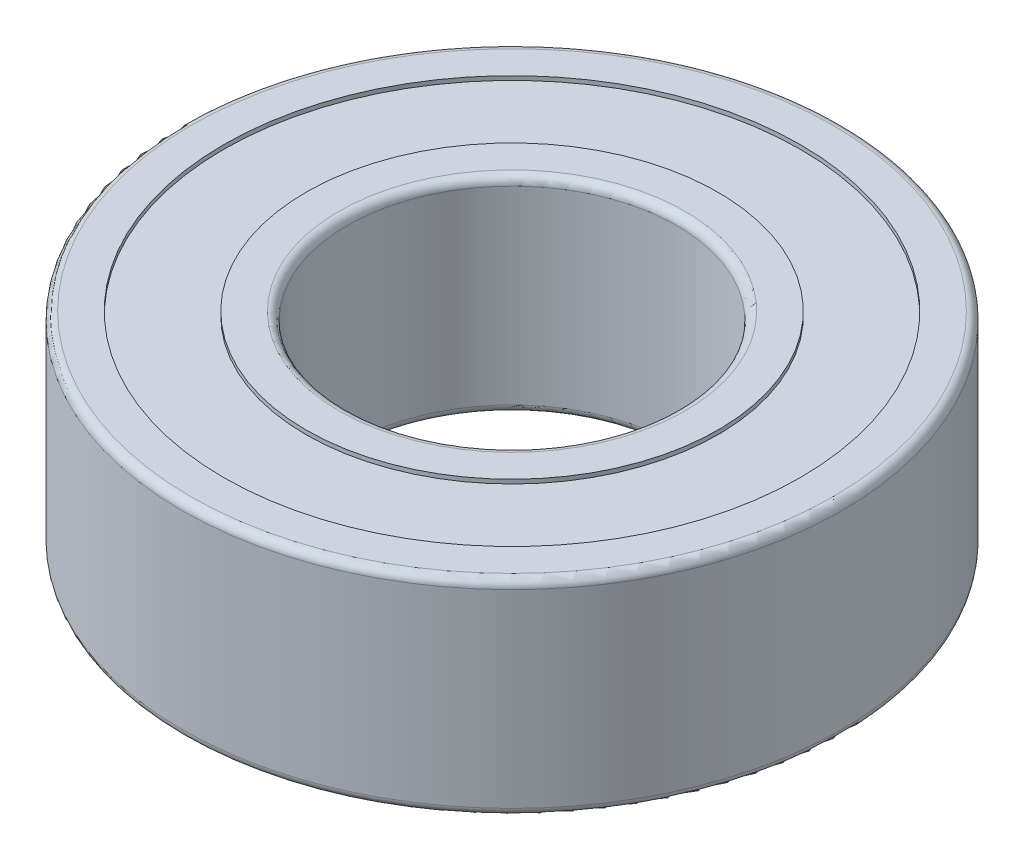
ISO-10303-21;
HEADER;
FILE_DESCRIPTION(('STEP AP214'),'2;1');
FILE_NAME('part.step','',(''),(''),'','','');
FILE_SCHEMA(('AUTOMOTIVE_DESIGN { 1 0 10303 214 1 1 1 1 }'));
ENDSEC;
DATA;
#1=APPLICATION_CONTEXT('core data for automotive mechanical design processes');
#2=APPLICATION_PROTOCOL_DEFINITION('international standard','automotive_design',2000,#1);
#3=PRODUCT_CONTEXT('',#1,'mechanical');
#4=PRODUCT('Part','Part','',(#3));
#5=PRODUCT_RELATED_PRODUCT_CATEGORY('part','',(#4));
#6=PRODUCT_DEFINITION_FORMATION('','',#4);
#7=PRODUCT_DEFINITION_CONTEXT('part definition',#1,'design');
#8=PRODUCT_DEFINITION('design','',#6,#7);
#9=PRODUCT_DEFINITION_SHAPE('','',#8);
#10=(LENGTH_UNIT() NAMED_UNIT(*) SI_UNIT(.MILLI.,.METRE.));
#11=(NAMED_UNIT(*) PLANE_ANGLE_UNIT() SI_UNIT($,.RADIAN.));
#12=(NAMED_UNIT(*) SI_UNIT($,.STERADIAN.) SOLID_ANGLE_UNIT());
#13=UNCERTAINTY_MEASURE_WITH_UNIT(LENGTH_MEASURE(1.E-05),#10,'distance_accuracy_value','');
#14=(GEOMETRIC_REPRESENTATION_CONTEXT(3) GLOBAL_UNCERTAINTY_ASSIGNED_CONTEXT((#13)) GLOBAL_UNIT_ASSIGNED_CONTEXT((#10,
#11,#12)) REPRESENTATION_CONTEXT('',''));
#15=CARTESIAN_POINT('',(0.,0.,0.));
#16=DIRECTION('',(0.,0.,1.));
#17=DIRECTION('',(1.,0.,0.));
#18=AXIS2_PLACEMENT_3D('',#15,#16,#17);
#19=CARTESIAN_POINT('',(0.,0.,0.));
#20=DIRECTION('',(0.,1.,0.));
#21=DIRECTION('',(0.,0.,1.));
#22=AXIS2_PLACEMENT_3D('',#19,#20,#21);
#23=PLANE('',#22);
#24=CARTESIAN_POINT('',(0.,0.,0.));
#25=DIRECTION('',(0.,1.,0.));
#26=DIRECTION('',(0.,0.,1.));
#27=AXIS2_PLACEMENT_3D('',#24,#25,#26);
#28=CIRCLE('',#27,4.2);
#29=CARTESIAN_POINT('',(0.,0.,4.2));
#30=VERTEX_POINT('',#29);
#31=EDGE_CURVE('E69',#30,#30,#28,.T.);
#32=ORIENTED_EDGE('',*,*,#31,.T.);
#33=EDGE_LOOP('',(#32));
#34=FACE_BOUND('',#33,.T.);
#35=CARTESIAN_POINT('',(0.,0.,0.));
#36=DIRECTION('',(0.,-1.,0.));
#37=DIRECTION('',(0.,0.,-1.));
#38=AXIS2_PLACEMENT_3D('',#35,#36,#37);
#39=CIRCLE('',#38,5.);
#40=CARTESIAN_POINT('',(0.,0.,-5.));
#41=VERTEX_POINT('',#40);
#42=EDGE_CURVE('E102',#41,#41,#39,.T.);
#43=ORIENTED_EDGE('',*,*,#42,.T.);
#44=EDGE_LOOP('',(#43));
#45=FACE_BOUND('',#44,.T.);
#46=ADVANCED_FACE('F37',(#34,#45),#23,.F.);
#47=CARTESIAN_POINT('',(0.,5.,0.));
#48=DIRECTION('',(0.,1.,0.));
#49=DIRECTION('',(0.,0.,1.));
#50=AXIS2_PLACEMENT_3D('',#47,#48,#49);
#51=PLANE('',#50);
#52=CARTESIAN_POINT('',(0.,5.,0.));
#53=DIRECTION('',(0.,1.,0.));
#54=DIRECTION('',(0.,0.,1.));
#55=AXIS2_PLACEMENT_3D('',#52,#53,#54);
#56=CIRCLE('',#55,4.2);
#57=CARTESIAN_POINT('',(0.,5.,4.2));
#58=VERTEX_POINT('',#57);
#59=EDGE_CURVE('E10',#58,#58,#56,.F.);
#60=ORIENTED_EDGE('',*,*,#59,.T.);
#61=EDGE_LOOP('',(#60));
#62=FACE_BOUND('',#61,.T.);
#63=CARTESIAN_POINT('',(0.,5.,0.));
#64=DIRECTION('',(0.,1.,0.));
#65=DIRECTION('',(0.,0.,1.));
#66=AXIS2_PLACEMENT_3D('',#63,#64,#65);
#67=CIRCLE('',#66,5.);
#68=CARTESIAN_POINT('',(0.,5.,5.));
#69=VERTEX_POINT('',#68);
#70=EDGE_CURVE('E86',#69,#69,#67,.T.);
#71=ORIENTED_EDGE('',*,*,#70,.T.);
#72=EDGE_LOOP('',(#71));
#73=FACE_BOUND('',#72,.T.);
#74=ADVANCED_FACE('F160',(#62,#73),#51,.T.);
#75=CARTESIAN_POINT('',(0.,5.,0.));
#76=DIRECTION('',(0.,1.,0.));
#77=DIRECTION('',(0.,0.,1.));
#78=AXIS2_PLACEMENT_3D('',#75,#76,#77);
#79=CIRCLE('',#78,7.);
#80=CARTESIAN_POINT('',(0.,5.,7.));
#81=VERTEX_POINT('',#80);
#82=EDGE_CURVE('E78',#81,#81,#79,.T.);
#83=ORIENTED_EDGE('',*,*,#82,.F.);
#84=EDGE_LOOP('',(#83));
#85=FACE_BOUND('',#84,.T.);
#86=CARTESIAN_POINT('',(0.,5.,0.));
#87=DIRECTION('',(0.,1.,0.));
#88=DIRECTION('',(0.,0.,1.));
#89=AXIS2_PLACEMENT_3D('',#86,#87,#88);
#90=CIRCLE('',#89,7.8);
#91=CARTESIAN_POINT('',(0.,5.,7.8));
#92=VERTEX_POINT('',#91);
#93=EDGE_CURVE('E45',#92,#92,#90,.T.);
#94=ORIENTED_EDGE('',*,*,#93,.T.);
#95=EDGE_LOOP('',(#94));
#96=FACE_BOUND('',#95,.T.);
#97=ADVANCED_FACE('F130',(#85,#96),#51,.T.);
#98=CARTESIAN_POINT('',(0.,0.,0.));
#99=DIRECTION('',(0.,-1.,0.));
#100=DIRECTION('',(0.,0.,-1.));
#101=AXIS2_PLACEMENT_3D('',#98,#99,#100);
#102=CIRCLE('',#101,7.);
#103=CARTESIAN_POINT('',(0.,0.,-7.));
#104=VERTEX_POINT('',#103);
#105=EDGE_CURVE('E94',#104,#104,#102,.T.);
#106=ORIENTED_EDGE('',*,*,#105,.F.);
#107=EDGE_LOOP('',(#106));
#108=FACE_BOUND('',#107,.T.);
#109=CARTESIAN_POINT('',(0.,0.,0.));
#110=DIRECTION('',(0.,1.,0.));
#111=DIRECTION('',(0.,0.,1.));
#112=AXIS2_PLACEMENT_3D('',#109,#110,#111);
#113=CIRCLE('',#112,7.8);
#114=CARTESIAN_POINT('',(0.,0.,7.8));
#115=VERTEX_POINT('',#114);
#116=EDGE_CURVE('E73',#115,#115,#113,.F.);
#117=ORIENTED_EDGE('',*,*,#116,.T.);
#118=EDGE_LOOP('',(#117));
#119=FACE_BOUND('',#118,.T.);
#120=ADVANCED_FACE('F126',(#108,#119),#23,.F.);
#121=CARTESIAN_POINT('',(0.,5.,0.));
#122=DIRECTION('',(0.,-1.,0.));
#123=DIRECTION('',(0.,0.,-1.));
#124=AXIS2_PLACEMENT_3D('',#121,#122,#123);
#125=CYLINDRICAL_SURFACE('',#124,8.);
#126=CARTESIAN_POINT('',(0.,0.2,0.));
#127=DIRECTION('',(0.,1.,0.));
#128=DIRECTION('',(0.,0.,1.));
#129=AXIS2_PLACEMENT_3D('',#126,#127,#128);
#130=CIRCLE('',#129,8.);
#131=CARTESIAN_POINT('',(0.,0.2,8.));
#132=VERTEX_POINT('',#131);
#133=EDGE_CURVE('E50',#132,#132,#130,.T.);
#134=ORIENTED_EDGE('',*,*,#133,.T.);
#135=EDGE_LOOP('',(#134));
#136=FACE_BOUND('',#135,.T.);
#137=CARTESIAN_POINT('',(0.,4.8,0.));
#138=DIRECTION('',(0.,1.,0.));
#139=DIRECTION('',(0.,0.,1.));
#140=AXIS2_PLACEMENT_3D('',#137,#138,#139);
#141=CIRCLE('',#140,8.);
#142=CARTESIAN_POINT('',(0.,4.8,8.));
#143=VERTEX_POINT('',#142);
#144=EDGE_CURVE('E55',#143,#143,#141,.F.);
#145=ORIENTED_EDGE('',*,*,#144,.T.);
#146=EDGE_LOOP('',(#145));
#147=FACE_BOUND('',#146,.T.);
#148=ADVANCED_FACE('F129',(#136,#147),#125,.T.);
#149=CARTESIAN_POINT('',(0.,5.,0.));
#150=DIRECTION('',(0.,-1.,0.));
#151=DIRECTION('',(0.,0.,-1.));
#152=AXIS2_PLACEMENT_3D('',#149,#150,#151);
#153=CYLINDRICAL_SURFACE('',#152,4.);
#154=CARTESIAN_POINT('',(0.,0.2,0.));
#155=DIRECTION('',(0.,1.,0.));
#156=DIRECTION('',(0.,0.,1.));
#157=AXIS2_PLACEMENT_3D('',#154,#155,#156);
#158=CIRCLE('',#157,4.);
#159=CARTESIAN_POINT('',(0.,0.2,4.));
#160=VERTEX_POINT('',#159);
#161=EDGE_CURVE('E61',#160,#160,#158,.F.);
#162=ORIENTED_EDGE('',*,*,#161,.T.);
#163=EDGE_LOOP('',(#162));
#164=FACE_BOUND('',#163,.T.);
#165=CARTESIAN_POINT('',(0.,4.8,0.));
#166=DIRECTION('',(0.,1.,0.));
#167=DIRECTION('',(0.,0.,1.));
#168=AXIS2_PLACEMENT_3D('',#165,#166,#167);
#169=CIRCLE('',#168,4.);
#170=CARTESIAN_POINT('',(0.,4.8,4.));
#171=VERTEX_POINT('',#170);
#172=EDGE_CURVE('E65',#171,#171,#169,.T.);
#173=ORIENTED_EDGE('',*,*,#172,.T.);
#174=EDGE_LOOP('',(#173));
#175=FACE_BOUND('',#174,.T.);
#176=ADVANCED_FACE('F144',(#164,#175),#153,.F.);
#177=CARTESIAN_POINT('',(0.,0.2,0.));
#178=DIRECTION('',(0.,1.,0.));
#179=DIRECTION('',(0.,0.,1.));
#180=AXIS2_PLACEMENT_3D('',#177,#178,#179);
#181=TOROIDAL_SURFACE('',#180,4.2,0.2);
#182=ORIENTED_EDGE('',*,*,#161,.F.);
#183=EDGE_LOOP('',(#182));
#184=FACE_BOUND('',#183,.T.);
#185=ORIENTED_EDGE('',*,*,#31,.F.);
#186=EDGE_LOOP('',(#185));
#187=FACE_BOUND('',#186,.T.);
#188=ADVANCED_FACE('F138',(#184,#187),#181,.T.);
#189=CARTESIAN_POINT('',(0.,0.2,0.));
#190=DIRECTION('',(0.,1.,0.));
#191=DIRECTION('',(0.,0.,1.));
#192=AXIS2_PLACEMENT_3D('',#189,#190,#191);
#193=TOROIDAL_SURFACE('',#192,7.8,0.2);
#194=ORIENTED_EDGE('',*,*,#116,.F.);
#195=EDGE_LOOP('',(#194));
#196=FACE_BOUND('',#195,.T.);
#197=ORIENTED_EDGE('',*,*,#133,.F.);
#198=EDGE_LOOP('',(#197));
#199=FACE_BOUND('',#198,.T.);
#200=ADVANCED_FACE('F134',(#196,#199),#193,.T.);
#201=CARTESIAN_POINT('',(0.,4.8,0.));
#202=DIRECTION('',(0.,1.,0.));
#203=DIRECTION('',(0.,0.,1.));
#204=AXIS2_PLACEMENT_3D('',#201,#202,#203);
#205=TOROIDAL_SURFACE('',#204,4.2,0.2);
#206=ORIENTED_EDGE('',*,*,#59,.F.);
#207=EDGE_LOOP('',(#206));
#208=FACE_BOUND('',#207,.T.);
#209=ORIENTED_EDGE('',*,*,#172,.F.);
#210=EDGE_LOOP('',(#209));
#211=FACE_BOUND('',#210,.T.);
#212=ADVANCED_FACE('F137',(#208,#211),#205,.T.);
#213=CARTESIAN_POINT('',(0.,4.8,0.));
#214=DIRECTION('',(0.,1.,0.));
#215=DIRECTION('',(0.,0.,1.));
#216=AXIS2_PLACEMENT_3D('',#213,#214,#215);
#217=TOROIDAL_SURFACE('',#216,7.8,0.2);
#218=ORIENTED_EDGE('',*,*,#144,.F.);
#219=EDGE_LOOP('',(#218));
#220=FACE_BOUND('',#219,.T.);
#221=ORIENTED_EDGE('',*,*,#93,.F.);
#222=EDGE_LOOP('',(#221));
#223=FACE_BOUND('',#222,.T.);
#224=ADVANCED_FACE('F39',(#220,#223),#217,.T.);
#225=CARTESIAN_POINT('',(0.,4.9,0.));
#226=DIRECTION('',(0.,1.,0.));
#227=DIRECTION('',(0.,0.,1.));
#228=AXIS2_PLACEMENT_3D('',#225,#226,#227);
#229=CYLINDRICAL_SURFACE('',#228,7.);
#230=CARTESIAN_POINT('',(0.,4.9,0.));
#231=DIRECTION('',(0.,1.,0.));
#232=DIRECTION('',(0.,0.,1.));
#233=AXIS2_PLACEMENT_3D('',#230,#231,#232);
#234=CIRCLE('',#233,7.);
#235=CARTESIAN_POINT('',(0.,4.9,7.));
#236=VERTEX_POINT('',#235);
#237=EDGE_CURVE('E77',#236,#236,#234,.T.);
#238=ORIENTED_EDGE('',*,*,#237,.F.);
#239=EDGE_LOOP('',(#238));
#240=FACE_BOUND('',#239,.T.);
#241=ORIENTED_EDGE('',*,*,#82,.T.);
#242=EDGE_LOOP('',(#241));
#243=FACE_BOUND('',#242,.T.);
#244=ADVANCED_FACE('F150',(#240,#243),#229,.F.);
#245=CARTESIAN_POINT('',(0.,4.9,0.));
#246=DIRECTION('',(0.,1.,0.));
#247=DIRECTION('',(0.,0.,1.));
#248=AXIS2_PLACEMENT_3D('',#245,#246,#247);
#249=PLANE('',#248);
#250=CARTESIAN_POINT('',(0.,4.9,0.));
#251=DIRECTION('',(0.,1.,0.));
#252=DIRECTION('',(0.,0.,1.));
#253=AXIS2_PLACEMENT_3D('',#250,#251,#252);
#254=CIRCLE('',#253,5.);
#255=CARTESIAN_POINT('',(0.,4.9,5.));
#256=VERTEX_POINT('',#255);
#257=EDGE_CURVE('E82',#256,#256,#254,.T.);
#258=ORIENTED_EDGE('',*,*,#257,.F.);
#259=EDGE_LOOP('',(#258));
#260=FACE_BOUND('',#259,.T.);
#261=ORIENTED_EDGE('',*,*,#237,.T.);
#262=EDGE_LOOP('',(#261));
#263=FACE_BOUND('',#262,.T.);
#264=ADVANCED_FACE('F155',(#260,#263),#249,.T.);
#265=CARTESIAN_POINT('',(0.,4.9,0.));
#266=DIRECTION('',(0.,1.,0.));
#267=DIRECTION('',(0.,0.,1.));
#268=AXIS2_PLACEMENT_3D('',#265,#266,#267);
#269=CYLINDRICAL_SURFACE('',#268,5.);
#270=ORIENTED_EDGE('',*,*,#257,.T.);
#271=EDGE_LOOP('',(#270));
#272=FACE_BOUND('',#271,.T.);
#273=ORIENTED_EDGE('',*,*,#70,.F.);
#274=EDGE_LOOP('',(#273));
#275=FACE_BOUND('',#274,.T.);
#276=ADVANCED_FACE('F122',(#272,#275),#269,.T.);
#277=CARTESIAN_POINT('',(0.,0.1,0.));
#278=DIRECTION('',(0.,-1.,0.));
#279=DIRECTION('',(0.,0.,-1.));
#280=AXIS2_PLACEMENT_3D('',#277,#278,#279);
#281=CYLINDRICAL_SURFACE('',#280,7.);
#282=CARTESIAN_POINT('',(0.,0.1,0.));
#283=DIRECTION('',(0.,-1.,0.));
#284=DIRECTION('',(0.,0.,-1.));
#285=AXIS2_PLACEMENT_3D('',#282,#283,#284);
#286=CIRCLE('',#285,7.);
#287=CARTESIAN_POINT('',(0.,0.1,-7.));
#288=VERTEX_POINT('',#287);
#289=EDGE_CURVE('E90',#288,#288,#286,.T.);
#290=ORIENTED_EDGE('',*,*,#289,.F.);
#291=EDGE_LOOP('',(#290));
#292=FACE_BOUND('',#291,.T.);
#293=ORIENTED_EDGE('',*,*,#105,.T.);
#294=EDGE_LOOP('',(#293));
#295=FACE_BOUND('',#294,.T.);
#296=ADVANCED_FACE('F116',(#292,#295),#281,.F.);
#297=CARTESIAN_POINT('',(0.,0.1,0.));
#298=DIRECTION('',(0.,-1.,0.));
#299=DIRECTION('',(0.,0.,-1.));
#300=AXIS2_PLACEMENT_3D('',#297,#298,#299);
#301=PLANE('',#300);
#302=CARTESIAN_POINT('',(0.,0.1,0.));
#303=DIRECTION('',(0.,-1.,0.));
#304=DIRECTION('',(0.,0.,-1.));
#305=AXIS2_PLACEMENT_3D('',#302,#303,#304);
#306=CIRCLE('',#305,5.);
#307=CARTESIAN_POINT('',(0.,0.1,-5.));
#308=VERTEX_POINT('',#307);
#309=EDGE_CURVE('E98',#308,#308,#306,.T.);
#310=ORIENTED_EDGE('',*,*,#309,.F.);
#311=EDGE_LOOP('',(#310));
#312=FACE_BOUND('',#311,.T.);
#313=ORIENTED_EDGE('',*,*,#289,.T.);
#314=EDGE_LOOP('',(#313));
#315=FACE_BOUND('',#314,.T.);
#316=ADVANCED_FACE('F113',(#312,#315),#301,.T.);
#317=CARTESIAN_POINT('',(0.,0.1,0.));
#318=DIRECTION('',(0.,-1.,0.));
#319=DIRECTION('',(0.,0.,-1.));
#320=AXIS2_PLACEMENT_3D('',#317,#318,#319);
#321=CYLINDRICAL_SURFACE('',#320,5.);
#322=ORIENTED_EDGE('',*,*,#309,.T.);
#323=EDGE_LOOP('',(#322));
#324=FACE_BOUND('',#323,.T.);
#325=ORIENTED_EDGE('',*,*,#42,.F.);
#326=EDGE_LOOP('',(#325));
#327=FACE_BOUND('',#326,.T.);
#328=ADVANCED_FACE('F110',(#324,#327),#321,.T.);
#329=CLOSED_SHELL('',(#46,#74,#97,#120,#148,#176,#188,#200,#212,#224,#244,#264,#276,#296,#316,#328));
#330=MANIFOLD_SOLID_BREP('B2',#329);
#331=ADVANCED_BREP_SHAPE_REPRESENTATION('',(#18,#330),#14);
#332=SHAPE_DEFINITION_REPRESENTATION(#9,#331);
ENDSEC;
END-ISO-10303-21;
